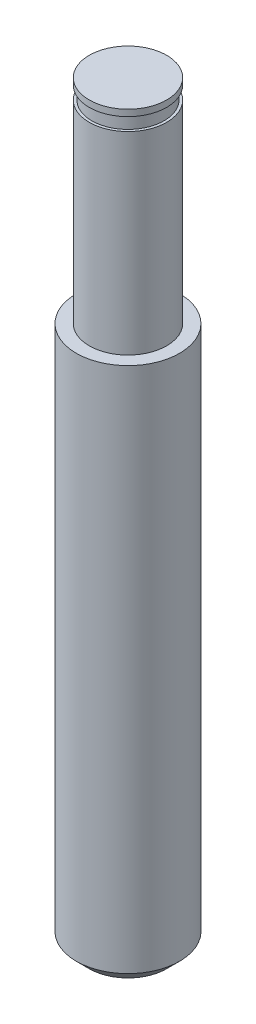
ISO-10303-21;
HEADER;
FILE_DESCRIPTION(('STEP AP214'),'2;1');
FILE_NAME('part.step','',(''),(''),'','','');
FILE_SCHEMA(('AUTOMOTIVE_DESIGN { 1 0 10303 214 1 1 1 1 }'));
ENDSEC;
DATA;
#1=APPLICATION_CONTEXT('core data for automotive mechanical design processes');
#2=APPLICATION_PROTOCOL_DEFINITION('international standard','automotive_design',2000,#1);
#3=PRODUCT_CONTEXT('',#1,'mechanical');
#4=PRODUCT('Part','Part','',(#3));
#5=PRODUCT_RELATED_PRODUCT_CATEGORY('part','',(#4));
#6=PRODUCT_DEFINITION_FORMATION('','',#4);
#7=PRODUCT_DEFINITION_CONTEXT('part definition',#1,'design');
#8=PRODUCT_DEFINITION('design','',#6,#7);
#9=PRODUCT_DEFINITION_SHAPE('','',#8);
#10=(LENGTH_UNIT() NAMED_UNIT(*) SI_UNIT(.MILLI.,.METRE.));
#11=(NAMED_UNIT(*) PLANE_ANGLE_UNIT() SI_UNIT($,.RADIAN.));
#12=(NAMED_UNIT(*) SI_UNIT($,.STERADIAN.) SOLID_ANGLE_UNIT());
#13=UNCERTAINTY_MEASURE_WITH_UNIT(LENGTH_MEASURE(1.E-05),#10,'distance_accuracy_value','');
#14=(GEOMETRIC_REPRESENTATION_CONTEXT(3) GLOBAL_UNCERTAINTY_ASSIGNED_CONTEXT((#13)) GLOBAL_UNIT_ASSIGNED_CONTEXT((#10,
#11,#12)) REPRESENTATION_CONTEXT('',''));
#15=CARTESIAN_POINT('',(0.,0.,0.));
#16=DIRECTION('',(0.,0.,1.));
#17=DIRECTION('',(1.,0.,0.));
#18=AXIS2_PLACEMENT_3D('',#15,#16,#17);
#19=CARTESIAN_POINT('',(0.,29.15,0.));
#20=DIRECTION('',(0.,-1.,0.));
#21=DIRECTION('',(0.,0.,-1.));
#22=AXIS2_PLACEMENT_3D('',#19,#20,#21);
#23=PLANE('',#22);
#24=CARTESIAN_POINT('',(0.,29.15,0.));
#25=DIRECTION('',(0.,1.,0.));
#26=DIRECTION('',(0.,0.,1.));
#27=AXIS2_PLACEMENT_3D('',#24,#25,#26);
#28=CIRCLE('',#27,2.99999999999998);
#29=CARTESIAN_POINT('',(0.,29.15,2.99999999999998));
#30=VERTEX_POINT('',#29);
#31=EDGE_CURVE('E41',#30,#30,#28,.T.);
#32=ORIENTED_EDGE('',*,*,#31,.T.);
#33=EDGE_LOOP('',(#32));
#34=FACE_BOUND('',#33,.T.);
#35=ADVANCED_FACE('F30',(#34),#23,.F.);
#36=CARTESIAN_POINT('',(0.,29.15,0.));
#37=DIRECTION('',(0.,1.,0.));
#38=DIRECTION('',(0.,0.,1.));
#39=AXIS2_PLACEMENT_3D('',#36,#37,#38);
#40=CYLINDRICAL_SURFACE('',#39,2.99999999999998);
#41=ORIENTED_EDGE('',*,*,#31,.F.);
#42=EDGE_LOOP('',(#41));
#43=FACE_BOUND('',#42,.T.);
#44=CARTESIAN_POINT('',(0.,28.65,0.));
#45=DIRECTION('',(0.,1.,0.));
#46=DIRECTION('',(0.,0.,1.));
#47=AXIS2_PLACEMENT_3D('',#44,#45,#46);
#48=CIRCLE('',#47,2.99999999999998);
#49=CARTESIAN_POINT('',(0.,28.65,2.99999999999998));
#50=VERTEX_POINT('',#49);
#51=EDGE_CURVE('E45',#50,#50,#48,.T.);
#52=ORIENTED_EDGE('',*,*,#51,.T.);
#53=EDGE_LOOP('',(#52));
#54=FACE_BOUND('',#53,.T.);
#55=ADVANCED_FACE('F81',(#43,#54),#40,.T.);
#56=CARTESIAN_POINT('',(2.99999999999999,28.65,0.));
#57=DIRECTION('',(0.,1.,0.));
#58=DIRECTION('',(0.,0.,1.));
#59=AXIS2_PLACEMENT_3D('',#56,#57,#58);
#60=PLANE('',#59);
#61=ORIENTED_EDGE('',*,*,#51,.F.);
#62=EDGE_LOOP('',(#61));
#63=FACE_BOUND('',#62,.T.);
#64=CARTESIAN_POINT('',(0.,28.65,0.));
#65=DIRECTION('',(0.,1.,0.));
#66=DIRECTION('',(0.,0.,1.));
#67=AXIS2_PLACEMENT_3D('',#64,#65,#66);
#68=CIRCLE('',#67,2.79999999999999);
#69=CARTESIAN_POINT('',(0.,28.65,2.79999999999999));
#70=VERTEX_POINT('',#69);
#71=EDGE_CURVE('E50',#70,#70,#68,.T.);
#72=ORIENTED_EDGE('',*,*,#71,.T.);
#73=EDGE_LOOP('',(#72));
#74=FACE_BOUND('',#73,.T.);
#75=ADVANCED_FACE('F86',(#63,#74),#60,.F.);
#76=CARTESIAN_POINT('',(0.,29.15,0.));
#77=DIRECTION('',(0.,1.,0.));
#78=DIRECTION('',(0.,0.,1.));
#79=AXIS2_PLACEMENT_3D('',#76,#77,#78);
#80=CYLINDRICAL_SURFACE('',#79,2.79999999999999);
#81=ORIENTED_EDGE('',*,*,#71,.F.);
#82=EDGE_LOOP('',(#81));
#83=FACE_BOUND('',#82,.T.);
#84=CARTESIAN_POINT('',(0.,27.65,0.));
#85=DIRECTION('',(0.,1.,0.));
#86=DIRECTION('',(0.,0.,1.));
#87=AXIS2_PLACEMENT_3D('',#84,#85,#86);
#88=CIRCLE('',#87,2.79999999999999);
#89=CARTESIAN_POINT('',(0.,27.65,2.79999999999999));
#90=VERTEX_POINT('',#89);
#91=EDGE_CURVE('E53',#90,#90,#88,.T.);
#92=ORIENTED_EDGE('',*,*,#91,.T.);
#93=EDGE_LOOP('',(#92));
#94=FACE_BOUND('',#93,.T.);
#95=ADVANCED_FACE('F92',(#83,#94),#80,.T.);
#96=CARTESIAN_POINT('',(2.8,27.65,0.));
#97=DIRECTION('',(0.,-1.,0.));
#98=DIRECTION('',(0.,0.,-1.));
#99=AXIS2_PLACEMENT_3D('',#96,#97,#98);
#100=PLANE('',#99);
#101=ORIENTED_EDGE('',*,*,#91,.F.);
#102=EDGE_LOOP('',(#101));
#103=FACE_BOUND('',#102,.T.);
#104=CARTESIAN_POINT('',(0.,27.65,0.));
#105=DIRECTION('',(0.,1.,0.));
#106=DIRECTION('',(0.,0.,1.));
#107=AXIS2_PLACEMENT_3D('',#104,#105,#106);
#108=CIRCLE('',#107,2.99999999999998);
#109=CARTESIAN_POINT('',(0.,27.65,2.99999999999998));
#110=VERTEX_POINT('',#109);
#111=EDGE_CURVE('E56',#110,#110,#108,.T.);
#112=ORIENTED_EDGE('',*,*,#111,.T.);
#113=EDGE_LOOP('',(#112));
#114=FACE_BOUND('',#113,.T.);
#115=ADVANCED_FACE('F96',(#103,#114),#100,.F.);
#116=CARTESIAN_POINT('',(0.,29.15,0.));
#117=DIRECTION('',(0.,1.,0.));
#118=DIRECTION('',(0.,0.,1.));
#119=AXIS2_PLACEMENT_3D('',#116,#117,#118);
#120=CYLINDRICAL_SURFACE('',#119,2.99999999999999);
#121=ORIENTED_EDGE('',*,*,#111,.F.);
#122=EDGE_LOOP('',(#121));
#123=FACE_BOUND('',#122,.T.);
#124=CARTESIAN_POINT('',(0.,12.65,0.));
#125=DIRECTION('',(0.,1.,0.));
#126=DIRECTION('',(0.,0.,1.));
#127=AXIS2_PLACEMENT_3D('',#124,#125,#126);
#128=CIRCLE('',#127,2.99999999999999);
#129=CARTESIAN_POINT('',(0.,12.65,2.99999999999999));
#130=VERTEX_POINT('',#129);
#131=EDGE_CURVE('E59',#130,#130,#128,.T.);
#132=ORIENTED_EDGE('',*,*,#131,.T.);
#133=EDGE_LOOP('',(#132));
#134=FACE_BOUND('',#133,.T.);
#135=ADVANCED_FACE('F77',(#123,#134),#120,.T.);
#136=CARTESIAN_POINT('',(3.,12.65,0.));
#137=DIRECTION('',(0.,-1.,0.));
#138=DIRECTION('',(0.,0.,-1.));
#139=AXIS2_PLACEMENT_3D('',#136,#137,#138);
#140=PLANE('',#139);
#141=ORIENTED_EDGE('',*,*,#131,.F.);
#142=EDGE_LOOP('',(#141));
#143=FACE_BOUND('',#142,.T.);
#144=CARTESIAN_POINT('',(0.,12.65,0.));
#145=DIRECTION('',(0.,1.,0.));
#146=DIRECTION('',(0.,0.,1.));
#147=AXIS2_PLACEMENT_3D('',#144,#145,#146);
#148=CIRCLE('',#147,3.99999999999999);
#149=CARTESIAN_POINT('',(0.,12.65,3.99999999999999));
#150=VERTEX_POINT('',#149);
#151=EDGE_CURVE('E62',#150,#150,#148,.T.);
#152=ORIENTED_EDGE('',*,*,#151,.T.);
#153=EDGE_LOOP('',(#152));
#154=FACE_BOUND('',#153,.T.);
#155=ADVANCED_FACE('F66',(#143,#154),#140,.F.);
#156=CARTESIAN_POINT('',(0.,29.15,0.));
#157=DIRECTION('',(0.,1.,0.));
#158=DIRECTION('',(0.,0.,1.));
#159=AXIS2_PLACEMENT_3D('',#156,#157,#158);
#160=CYLINDRICAL_SURFACE('',#159,3.99999999999999);
#161=CARTESIAN_POINT('',(0.,-28.15,0.));
#162=DIRECTION('',(0.,1.,0.));
#163=DIRECTION('',(0.,0.,1.));
#164=AXIS2_PLACEMENT_3D('',#161,#162,#163);
#165=CIRCLE('',#164,3.99999999999999);
#166=CARTESIAN_POINT('',(0.,-28.15,3.99999999999999));
#167=VERTEX_POINT('',#166);
#168=EDGE_CURVE('E37',#167,#167,#165,.T.);
#169=ORIENTED_EDGE('',*,*,#168,.T.);
#170=EDGE_LOOP('',(#169));
#171=FACE_BOUND('',#170,.T.);
#172=ORIENTED_EDGE('',*,*,#151,.F.);
#173=EDGE_LOOP('',(#172));
#174=FACE_BOUND('',#173,.T.);
#175=ADVANCED_FACE('F68',(#171,#174),#160,.T.);
#176=CARTESIAN_POINT('',(4.00000000000001,-29.15,0.));
#177=DIRECTION('',(0.,1.,0.));
#178=DIRECTION('',(0.,0.,1.));
#179=AXIS2_PLACEMENT_3D('',#176,#177,#178);
#180=PLANE('',#179);
#181=CARTESIAN_POINT('',(0.,-29.15,0.));
#182=DIRECTION('',(0.,1.,0.));
#183=DIRECTION('',(0.,0.,1.));
#184=AXIS2_PLACEMENT_3D('',#181,#182,#183);
#185=CIRCLE('',#184,3.);
#186=CARTESIAN_POINT('',(0.,-29.15,3.));
#187=VERTEX_POINT('',#186);
#188=EDGE_CURVE('E10',#187,#187,#185,.F.);
#189=ORIENTED_EDGE('',*,*,#188,.T.);
#190=EDGE_LOOP('',(#189));
#191=FACE_BOUND('',#190,.T.);
#192=ADVANCED_FACE('F70',(#191),#180,.F.);
#193=CARTESIAN_POINT('',(0.,-28.15,0.));
#194=DIRECTION('',(0.,1.,0.));
#195=DIRECTION('',(0.,0.,1.));
#196=AXIS2_PLACEMENT_3D('',#193,#194,#195);
#197=CONICAL_SURFACE('',#196,3.99999999999999,0.785398163397451);
#198=ORIENTED_EDGE('',*,*,#188,.F.);
#199=EDGE_LOOP('',(#198));
#200=FACE_BOUND('',#199,.T.);
#201=ORIENTED_EDGE('',*,*,#168,.F.);
#202=EDGE_LOOP('',(#201));
#203=FACE_BOUND('',#202,.T.);
#204=ADVANCED_FACE('F32',(#200,#203),#197,.T.);
#205=CLOSED_SHELL('',(#35,#55,#75,#95,#115,#135,#155,#175,#192,#204));
#206=MANIFOLD_SOLID_BREP('B2',#205);
#207=ADVANCED_BREP_SHAPE_REPRESENTATION('',(#18,#206),#14);
#208=SHAPE_DEFINITION_REPRESENTATION(#9,#207);
ENDSEC;
END-ISO-10303-21;
